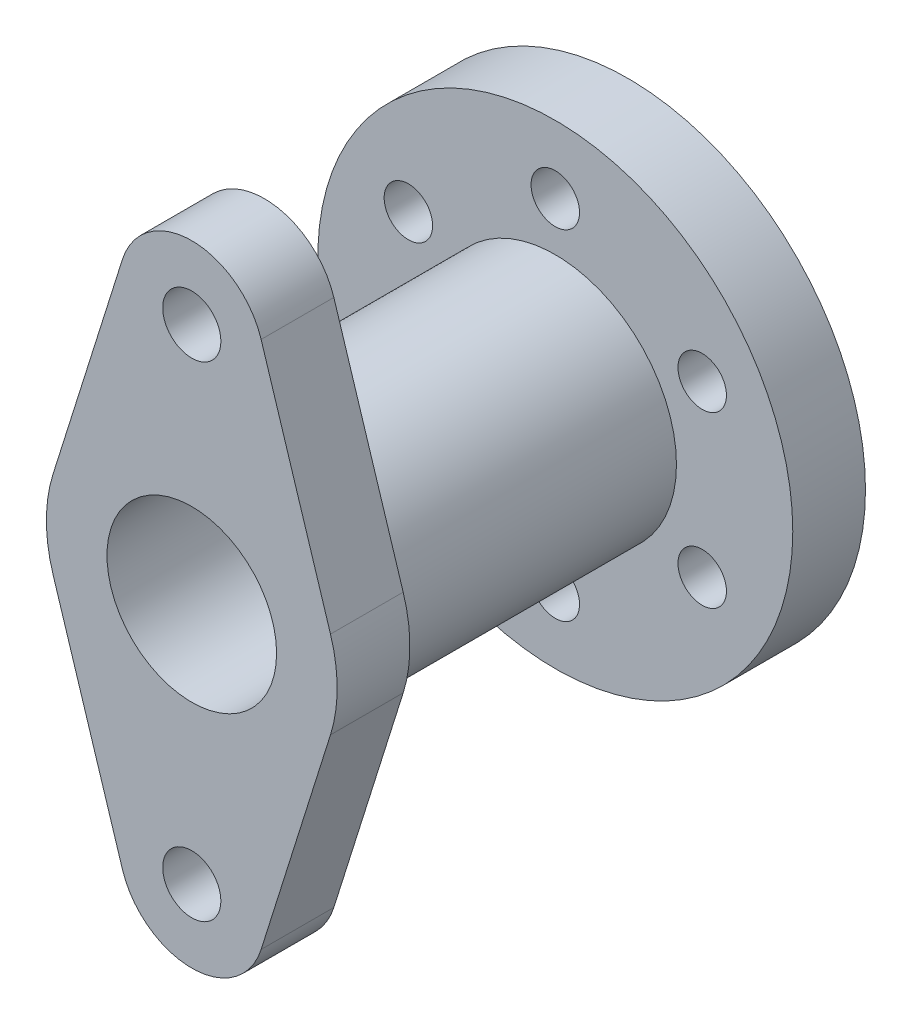
ISO-10303-21;
HEADER;
FILE_DESCRIPTION(('STEP AP214'),'2;1');
FILE_NAME('part.step','',(''),(''),'','','');
FILE_SCHEMA(('AUTOMOTIVE_DESIGN { 1 0 10303 214 1 1 1 1 }'));
ENDSEC;
DATA;
#1=APPLICATION_CONTEXT('core data for automotive mechanical design processes');
#2=APPLICATION_PROTOCOL_DEFINITION('international standard','automotive_design',2000,#1);
#3=PRODUCT_CONTEXT('',#1,'mechanical');
#4=PRODUCT('Part','Part','',(#3));
#5=PRODUCT_RELATED_PRODUCT_CATEGORY('part','',(#4));
#6=PRODUCT_DEFINITION_FORMATION('','',#4);
#7=PRODUCT_DEFINITION_CONTEXT('part definition',#1,'design');
#8=PRODUCT_DEFINITION('design','',#6,#7);
#9=PRODUCT_DEFINITION_SHAPE('','',#8);
#10=(LENGTH_UNIT() NAMED_UNIT(*) SI_UNIT(.MILLI.,.METRE.));
#11=(NAMED_UNIT(*) PLANE_ANGLE_UNIT() SI_UNIT($,.RADIAN.));
#12=(NAMED_UNIT(*) SI_UNIT($,.STERADIAN.) SOLID_ANGLE_UNIT());
#13=UNCERTAINTY_MEASURE_WITH_UNIT(LENGTH_MEASURE(1.E-05),#10,'distance_accuracy_value','');
#14=(GEOMETRIC_REPRESENTATION_CONTEXT(3) GLOBAL_UNCERTAINTY_ASSIGNED_CONTEXT((#13)) GLOBAL_UNIT_ASSIGNED_CONTEXT((#10,
#11,#12)) REPRESENTATION_CONTEXT('',''));
#15=CARTESIAN_POINT('',(0.,0.,0.));
#16=DIRECTION('',(0.,0.,1.));
#17=DIRECTION('',(1.,0.,0.));
#18=AXIS2_PLACEMENT_3D('',#15,#16,#17);
#19=CARTESIAN_POINT('',(0.,0.,190.5));
#20=DIRECTION('',(0.,0.,-1.));
#21=DIRECTION('',(-1.,0.,0.));
#22=AXIS2_PLACEMENT_3D('',#19,#20,#21);
#23=CYLINDRICAL_SURFACE('',#22,1244.6);
#24=CARTESIAN_POINT('',(0.,0.,190.5));
#25=DIRECTION('',(0.,0.,1.));
#26=DIRECTION('',(1.,0.,0.));
#27=AXIS2_PLACEMENT_3D('',#24,#25,#26);
#28=CIRCLE('',#27,1244.6);
#29=CARTESIAN_POINT('',(1244.6,0.,190.5));
#30=VERTEX_POINT('',#29);
#31=EDGE_CURVE('E11',#30,#30,#28,.T.);
#32=ORIENTED_EDGE('',*,*,#31,.F.);
#33=EDGE_LOOP('',(#32));
#34=FACE_BOUND('',#33,.T.);
#35=CARTESIAN_POINT('',(0.,0.,-190.5));
#36=DIRECTION('',(0.,0.,1.));
#37=DIRECTION('',(1.,0.,0.));
#38=AXIS2_PLACEMENT_3D('',#35,#36,#37);
#39=CIRCLE('',#38,1244.6);
#40=CARTESIAN_POINT('',(1244.6,0.,-190.5));
#41=VERTEX_POINT('',#40);
#42=EDGE_CURVE('E42',#41,#41,#39,.T.);
#43=ORIENTED_EDGE('',*,*,#42,.T.);
#44=EDGE_LOOP('',(#43));
#45=FACE_BOUND('',#44,.T.);
#46=ADVANCED_FACE('F39',(#34,#45),#23,.T.);
#47=CARTESIAN_POINT('',(0.,0.,190.5));
#48=DIRECTION('',(0.,0.,1.));
#49=DIRECTION('',(1.,0.,0.));
#50=AXIS2_PLACEMENT_3D('',#47,#48,#49);
#51=PLANE('',#50);
#52=CARTESIAN_POINT('',(0.,0.,190.5));
#53=DIRECTION('',(0.,0.,1.));
#54=DIRECTION('',(1.,0.,0.));
#55=AXIS2_PLACEMENT_3D('',#52,#53,#54);
#56=CIRCLE('',#55,635.);
#57=CARTESIAN_POINT('',(635.,0.,190.5));
#58=VERTEX_POINT('',#57);
#59=EDGE_CURVE('E167',#58,#58,#56,.T.);
#60=ORIENTED_EDGE('',*,*,#59,.F.);
#61=EDGE_LOOP('',(#60));
#62=FACE_BOUND('',#61,.T.);
#63=CARTESIAN_POINT('',(0.,889.,190.5));
#64=DIRECTION('',(0.,0.,1.));
#65=DIRECTION('',(1.,0.,0.));
#66=AXIS2_PLACEMENT_3D('',#63,#64,#65);
#67=CIRCLE('',#66,127.);
#68=CARTESIAN_POINT('',(127.,889.,190.5));
#69=VERTEX_POINT('',#68);
#70=EDGE_CURVE('E177',#69,#69,#67,.T.);
#71=ORIENTED_EDGE('',*,*,#70,.F.);
#72=EDGE_LOOP('',(#71));
#73=FACE_BOUND('',#72,.T.);
#74=CARTESIAN_POINT('',(-769.896583964361,444.500000000009,190.5));
#75=DIRECTION('',(0.,0.,1.));
#76=DIRECTION('',(1.,0.,0.));
#77=AXIS2_PLACEMENT_3D('',#74,#75,#76);
#78=CIRCLE('',#77,127.);
#79=CARTESIAN_POINT('',(-642.896583964361,444.500000000009,190.5));
#80=VERTEX_POINT('',#79);
#81=EDGE_CURVE('E181',#80,#80,#78,.T.);
#82=ORIENTED_EDGE('',*,*,#81,.F.);
#83=EDGE_LOOP('',(#82));
#84=FACE_BOUND('',#83,.T.);
#85=CARTESIAN_POINT('',(-769.896583964366,-444.5,190.5));
#86=DIRECTION('',(0.,0.,1.));
#87=DIRECTION('',(1.,0.,0.));
#88=AXIS2_PLACEMENT_3D('',#85,#86,#87);
#89=CIRCLE('',#88,127.000000000008);
#90=CARTESIAN_POINT('',(-642.896583964358,-444.5,190.5));
#91=VERTEX_POINT('',#90);
#92=EDGE_CURVE('E204',#91,#91,#89,.T.);
#93=ORIENTED_EDGE('',*,*,#92,.F.);
#94=EDGE_LOOP('',(#93));
#95=FACE_BOUND('',#94,.T.);
#96=CARTESIAN_POINT('',(0.,-889.,190.5));
#97=DIRECTION('',(0.,0.,1.));
#98=DIRECTION('',(1.,0.,0.));
#99=AXIS2_PLACEMENT_3D('',#96,#97,#98);
#100=CIRCLE('',#99,127.000000000006);
#101=CARTESIAN_POINT('',(127.000000000006,-889.,190.5));
#102=VERTEX_POINT('',#101);
#103=EDGE_CURVE('E198',#102,#102,#100,.T.);
#104=ORIENTED_EDGE('',*,*,#103,.F.);
#105=EDGE_LOOP('',(#104));
#106=FACE_BOUND('',#105,.T.);
#107=CARTESIAN_POINT('',(769.896583964374,-444.499999999987,190.5));
#108=DIRECTION('',(0.,0.,1.));
#109=DIRECTION('',(1.,0.,0.));
#110=AXIS2_PLACEMENT_3D('',#107,#108,#109);
#111=CIRCLE('',#110,127.000000000018);
#112=CARTESIAN_POINT('',(896.896583964392,-444.499999999987,190.5));
#113=VERTEX_POINT('',#112);
#114=EDGE_CURVE('E192',#113,#113,#111,.T.);
#115=ORIENTED_EDGE('',*,*,#114,.F.);
#116=EDGE_LOOP('',(#115));
#117=FACE_BOUND('',#116,.T.);
#118=CARTESIAN_POINT('',(769.896583964359,444.500000000013,190.5));
#119=DIRECTION('',(0.,0.,1.));
#120=DIRECTION('',(1.,0.,0.));
#121=AXIS2_PLACEMENT_3D('',#118,#119,#120);
#122=CIRCLE('',#121,127.000000000016);
#123=CARTESIAN_POINT('',(896.896583964375,444.500000000013,190.5));
#124=VERTEX_POINT('',#123);
#125=EDGE_CURVE('E180',#124,#124,#122,.T.);
#126=ORIENTED_EDGE('',*,*,#125,.F.);
#127=EDGE_LOOP('',(#126));
#128=FACE_BOUND('',#127,.T.);
#129=ORIENTED_EDGE('',*,*,#31,.T.);
#130=EDGE_LOOP('',(#129));
#131=FACE_BOUND('',#130,.T.);
#132=ADVANCED_FACE('F221',(#62,#73,#84,#95,#106,#117,#128,#131),#51,.T.);
#133=CARTESIAN_POINT('',(0.,0.,-190.5));
#134=DIRECTION('',(0.,0.,1.));
#135=DIRECTION('',(1.,0.,0.));
#136=AXIS2_PLACEMENT_3D('',#133,#134,#135);
#137=PLANE('',#136);
#138=CARTESIAN_POINT('',(0.,0.,-190.5));
#139=DIRECTION('',(0.,0.,1.));
#140=DIRECTION('',(1.,0.,0.));
#141=AXIS2_PLACEMENT_3D('',#138,#139,#140);
#142=CIRCLE('',#141,330.2);
#143=CARTESIAN_POINT('',(330.2,0.,-190.5));
#144=VERTEX_POINT('',#143);
#145=EDGE_CURVE('E324',#144,#144,#142,.T.);
#146=ORIENTED_EDGE('',*,*,#145,.T.);
#147=EDGE_LOOP('',(#146));
#148=FACE_BOUND('',#147,.T.);
#149=CARTESIAN_POINT('',(0.,889.,-190.5));
#150=DIRECTION('',(0.,0.,1.));
#151=DIRECTION('',(1.,0.,0.));
#152=AXIS2_PLACEMENT_3D('',#149,#150,#151);
#153=CIRCLE('',#152,127.);
#154=CARTESIAN_POINT('',(127.,889.,-190.5));
#155=VERTEX_POINT('',#154);
#156=EDGE_CURVE('E174',#155,#155,#153,.T.);
#157=ORIENTED_EDGE('',*,*,#156,.T.);
#158=EDGE_LOOP('',(#157));
#159=FACE_BOUND('',#158,.T.);
#160=CARTESIAN_POINT('',(-769.896583964361,444.500000000009,-190.5));
#161=DIRECTION('',(0.,0.,1.));
#162=DIRECTION('',(1.,0.,0.));
#163=AXIS2_PLACEMENT_3D('',#160,#161,#162);
#164=CIRCLE('',#163,127.);
#165=CARTESIAN_POINT('',(-642.896583964361,444.500000000009,-190.5));
#166=VERTEX_POINT('',#165);
#167=EDGE_CURVE('E171',#166,#166,#164,.T.);
#168=ORIENTED_EDGE('',*,*,#167,.T.);
#169=EDGE_LOOP('',(#168));
#170=FACE_BOUND('',#169,.T.);
#171=CARTESIAN_POINT('',(-769.896583964366,-444.5,-190.5));
#172=DIRECTION('',(0.,0.,1.));
#173=DIRECTION('',(1.,0.,0.));
#174=AXIS2_PLACEMENT_3D('',#171,#172,#173);
#175=CIRCLE('',#174,127.000000000008);
#176=CARTESIAN_POINT('',(-642.896583964358,-444.5,-190.5));
#177=VERTEX_POINT('',#176);
#178=EDGE_CURVE('E184',#177,#177,#175,.T.);
#179=ORIENTED_EDGE('',*,*,#178,.T.);
#180=EDGE_LOOP('',(#179));
#181=FACE_BOUND('',#180,.T.);
#182=CARTESIAN_POINT('',(0.,-889.,-190.5));
#183=DIRECTION('',(0.,0.,1.));
#184=DIRECTION('',(1.,0.,0.));
#185=AXIS2_PLACEMENT_3D('',#182,#183,#184);
#186=CIRCLE('',#185,127.000000000006);
#187=CARTESIAN_POINT('',(127.000000000006,-889.,-190.5));
#188=VERTEX_POINT('',#187);
#189=EDGE_CURVE('E201',#188,#188,#186,.T.);
#190=ORIENTED_EDGE('',*,*,#189,.T.);
#191=EDGE_LOOP('',(#190));
#192=FACE_BOUND('',#191,.T.);
#193=CARTESIAN_POINT('',(769.896583964374,-444.499999999987,-190.5));
#194=DIRECTION('',(0.,0.,1.));
#195=DIRECTION('',(1.,0.,0.));
#196=AXIS2_PLACEMENT_3D('',#193,#194,#195);
#197=CIRCLE('',#196,127.000000000018);
#198=CARTESIAN_POINT('',(896.896583964392,-444.499999999987,-190.5));
#199=VERTEX_POINT('',#198);
#200=EDGE_CURVE('E195',#199,#199,#197,.T.);
#201=ORIENTED_EDGE('',*,*,#200,.T.);
#202=EDGE_LOOP('',(#201));
#203=FACE_BOUND('',#202,.T.);
#204=CARTESIAN_POINT('',(769.896583964359,444.500000000013,-190.5));
#205=DIRECTION('',(0.,0.,1.));
#206=DIRECTION('',(1.,0.,0.));
#207=AXIS2_PLACEMENT_3D('',#204,#205,#206);
#208=CIRCLE('',#207,127.000000000016);
#209=CARTESIAN_POINT('',(896.896583964375,444.500000000013,-190.5));
#210=VERTEX_POINT('',#209);
#211=EDGE_CURVE('E189',#210,#210,#208,.T.);
#212=ORIENTED_EDGE('',*,*,#211,.T.);
#213=EDGE_LOOP('',(#212));
#214=FACE_BOUND('',#213,.T.);
#215=ORIENTED_EDGE('',*,*,#42,.F.);
#216=EDGE_LOOP('',(#215));
#217=FACE_BOUND('',#216,.T.);
#218=ADVANCED_FACE('F210',(#148,#159,#170,#181,#192,#203,#214,#217),#137,.F.);
#219=CARTESIAN_POINT('',(769.896583964359,444.500000000013,-190.5));
#220=DIRECTION('',(0.,0.,1.));
#221=DIRECTION('',(1.,0.,0.));
#222=AXIS2_PLACEMENT_3D('',#219,#220,#221);
#223=CYLINDRICAL_SURFACE('',#222,127.000000000016);
#224=ORIENTED_EDGE('',*,*,#211,.F.);
#225=EDGE_LOOP('',(#224));
#226=FACE_BOUND('',#225,.T.);
#227=ORIENTED_EDGE('',*,*,#125,.T.);
#228=EDGE_LOOP('',(#227));
#229=FACE_BOUND('',#228,.T.);
#230=ADVANCED_FACE('F240',(#226,#229),#223,.F.);
#231=CARTESIAN_POINT('',(769.896583964374,-444.499999999987,-190.5));
#232=DIRECTION('',(0.,0.,1.));
#233=DIRECTION('',(1.,0.,0.));
#234=AXIS2_PLACEMENT_3D('',#231,#232,#233);
#235=CYLINDRICAL_SURFACE('',#234,127.000000000018);
#236=ORIENTED_EDGE('',*,*,#200,.F.);
#237=EDGE_LOOP('',(#236));
#238=FACE_BOUND('',#237,.T.);
#239=ORIENTED_EDGE('',*,*,#114,.T.);
#240=EDGE_LOOP('',(#239));
#241=FACE_BOUND('',#240,.T.);
#242=ADVANCED_FACE('F245',(#238,#241),#235,.F.);
#243=CARTESIAN_POINT('',(0.,-889.,-190.5));
#244=DIRECTION('',(0.,0.,1.));
#245=DIRECTION('',(1.,0.,0.));
#246=AXIS2_PLACEMENT_3D('',#243,#244,#245);
#247=CYLINDRICAL_SURFACE('',#246,127.000000000006);
#248=ORIENTED_EDGE('',*,*,#189,.F.);
#249=EDGE_LOOP('',(#248));
#250=FACE_BOUND('',#249,.T.);
#251=ORIENTED_EDGE('',*,*,#103,.T.);
#252=EDGE_LOOP('',(#251));
#253=FACE_BOUND('',#252,.T.);
#254=ADVANCED_FACE('F217',(#250,#253),#247,.F.);
#255=CARTESIAN_POINT('',(-769.896583964366,-444.5,-190.5));
#256=DIRECTION('',(0.,0.,1.));
#257=DIRECTION('',(1.,0.,0.));
#258=AXIS2_PLACEMENT_3D('',#255,#256,#257);
#259=CYLINDRICAL_SURFACE('',#258,127.000000000008);
#260=ORIENTED_EDGE('',*,*,#178,.F.);
#261=EDGE_LOOP('',(#260));
#262=FACE_BOUND('',#261,.T.);
#263=ORIENTED_EDGE('',*,*,#92,.T.);
#264=EDGE_LOOP('',(#263));
#265=FACE_BOUND('',#264,.T.);
#266=ADVANCED_FACE('F213',(#262,#265),#259,.F.);
#267=CARTESIAN_POINT('',(-769.896583964361,444.500000000009,-190.5));
#268=DIRECTION('',(0.,0.,1.));
#269=DIRECTION('',(1.,0.,0.));
#270=AXIS2_PLACEMENT_3D('',#267,#268,#269);
#271=CYLINDRICAL_SURFACE('',#270,127.);
#272=ORIENTED_EDGE('',*,*,#167,.F.);
#273=EDGE_LOOP('',(#272));
#274=FACE_BOUND('',#273,.T.);
#275=ORIENTED_EDGE('',*,*,#81,.T.);
#276=EDGE_LOOP('',(#275));
#277=FACE_BOUND('',#276,.T.);
#278=ADVANCED_FACE('F216',(#274,#277),#271,.F.);
#279=CARTESIAN_POINT('',(0.,889.,-190.5));
#280=DIRECTION('',(0.,0.,1.));
#281=DIRECTION('',(1.,0.,0.));
#282=AXIS2_PLACEMENT_3D('',#279,#280,#281);
#283=CYLINDRICAL_SURFACE('',#282,127.);
#284=ORIENTED_EDGE('',*,*,#156,.F.);
#285=EDGE_LOOP('',(#284));
#286=FACE_BOUND('',#285,.T.);
#287=ORIENTED_EDGE('',*,*,#70,.T.);
#288=EDGE_LOOP('',(#287));
#289=FACE_BOUND('',#288,.T.);
#290=ADVANCED_FACE('F259',(#286,#289),#283,.F.);
#291=CARTESIAN_POINT('',(0.,0.,1714.5));
#292=DIRECTION('',(0.,0.,-1.));
#293=DIRECTION('',(-1.,0.,0.));
#294=AXIS2_PLACEMENT_3D('',#291,#292,#293);
#295=CYLINDRICAL_SURFACE('',#294,635.);
#296=CARTESIAN_POINT('',(0.,0.,1714.5));
#297=DIRECTION('',(0.,0.,1.));
#298=DIRECTION('',(1.,0.,0.));
#299=AXIS2_PLACEMENT_3D('',#296,#297,#298);
#300=CIRCLE('',#299,635.);
#301=CARTESIAN_POINT('',(635.,0.,1714.5));
#302=VERTEX_POINT('',#301);
#303=EDGE_CURVE('E168',#302,#302,#300,.T.);
#304=ORIENTED_EDGE('',*,*,#303,.F.);
#305=EDGE_LOOP('',(#304));
#306=FACE_BOUND('',#305,.T.);
#307=ORIENTED_EDGE('',*,*,#59,.T.);
#308=EDGE_LOOP('',(#307));
#309=FACE_BOUND('',#308,.T.);
#310=ADVANCED_FACE('F263',(#306,#309),#295,.T.);
#311=CARTESIAN_POINT('',(0.,-1270.,2095.5));
#312=DIRECTION('',(0.,0.,-1.));
#313=DIRECTION('',(-1.,0.,0.));
#314=AXIS2_PLACEMENT_3D('',#311,#312,#313);
#315=PLANE('',#314);
#316=CARTESIAN_POINT('',(0.,0.,2095.5));
#317=DIRECTION('',(0.,0.,1.));
#318=DIRECTION('',(1.,0.,0.));
#319=AXIS2_PLACEMENT_3D('',#316,#317,#318);
#320=CIRCLE('',#319,444.5);
#321=CARTESIAN_POINT('',(444.5,0.,2095.5));
#322=VERTEX_POINT('',#321);
#323=EDGE_CURVE('E329',#322,#322,#320,.T.);
#324=ORIENTED_EDGE('',*,*,#323,.F.);
#325=EDGE_LOOP('',(#324));
#326=FACE_BOUND('',#325,.T.);
#327=CARTESIAN_POINT('',(0.,-1270.,2095.5));
#328=DIRECTION('',(0.,0.,1.));
#329=DIRECTION('',(-1.,0.,0.));
#330=AXIS2_PLACEMENT_3D('',#327,#328,#329);
#331=CIRCLE('',#330,381.);
#332=CARTESIAN_POINT('',(-363.450835739856,-1384.3,2095.5));
#333=VERTEX_POINT('',#332);
#334=CARTESIAN_POINT('',(363.450835739856,-1384.3,2095.5));
#335=VERTEX_POINT('',#334);
#336=EDGE_CURVE('E152',#333,#335,#331,.T.);
#337=ORIENTED_EDGE('',*,*,#336,.T.);
#338=DIRECTION('',(0.3,0.953939201416946,0.));
#339=VECTOR('',#338,1.);
#340=CARTESIAN_POINT('',(363.450835739856,-1384.3,2095.5));
#341=LINE('',#340,#339);
#342=CARTESIAN_POINT('',(726.901671479712,-228.600000000003,2095.5));
#343=VERTEX_POINT('',#342);
#344=EDGE_CURVE('E99',#335,#343,#341,.T.);
#345=ORIENTED_EDGE('',*,*,#344,.T.);
#346=CARTESIAN_POINT('',(0.,0.,2095.5));
#347=DIRECTION('',(0.,0.,1.));
#348=DIRECTION('',(-1.,0.,0.));
#349=AXIS2_PLACEMENT_3D('',#346,#347,#348);
#350=CIRCLE('',#349,762.);
#351=CARTESIAN_POINT('',(726.901671479712,228.600000000003,2095.5));
#352=VERTEX_POINT('',#351);
#353=EDGE_CURVE('E350',#343,#352,#350,.T.);
#354=ORIENTED_EDGE('',*,*,#353,.T.);
#355=DIRECTION('',(-0.3,0.953939201416946,0.));
#356=VECTOR('',#355,1.);
#357=CARTESIAN_POINT('',(726.901671479712,228.600000000003,2095.5));
#358=LINE('',#357,#356);
#359=CARTESIAN_POINT('',(363.450835739856,1384.3,2095.5));
#360=VERTEX_POINT('',#359);
#361=EDGE_CURVE('E352',#352,#360,#358,.T.);
#362=ORIENTED_EDGE('',*,*,#361,.T.);
#363=CARTESIAN_POINT('',(0.,1270.,2095.5));
#364=DIRECTION('',(0.,0.,1.));
#365=DIRECTION('',(1.,0.,0.));
#366=AXIS2_PLACEMENT_3D('',#363,#364,#365);
#367=CIRCLE('',#366,381.);
#368=CARTESIAN_POINT('',(-363.450835739856,1384.3,2095.5));
#369=VERTEX_POINT('',#368);
#370=EDGE_CURVE('E119',#360,#369,#367,.T.);
#371=ORIENTED_EDGE('',*,*,#370,.T.);
#372=DIRECTION('',(-0.3,-0.953939201416946,0.));
#373=VECTOR('',#372,1.);
#374=CARTESIAN_POINT('',(-363.450835739856,1384.3,2095.5));
#375=LINE('',#374,#373);
#376=CARTESIAN_POINT('',(-726.901671479712,228.6,2095.5));
#377=VERTEX_POINT('',#376);
#378=EDGE_CURVE('E112',#369,#377,#375,.T.);
#379=ORIENTED_EDGE('',*,*,#378,.T.);
#380=CARTESIAN_POINT('',(0.,0.,2095.5));
#381=DIRECTION('',(0.,0.,1.));
#382=DIRECTION('',(-1.,0.,0.));
#383=AXIS2_PLACEMENT_3D('',#380,#381,#382);
#384=CIRCLE('',#383,762.);
#385=CARTESIAN_POINT('',(-726.901671479712,-228.6,2095.5));
#386=VERTEX_POINT('',#385);
#387=EDGE_CURVE('E117',#377,#386,#384,.T.);
#388=ORIENTED_EDGE('',*,*,#387,.T.);
#389=DIRECTION('',(0.3,-0.953939201416946,0.));
#390=VECTOR('',#389,1.);
#391=CARTESIAN_POINT('',(-726.901671479712,-228.6,2095.5));
#392=LINE('',#391,#390);
#393=EDGE_CURVE('E55',#386,#333,#392,.T.);
#394=ORIENTED_EDGE('',*,*,#393,.T.);
#395=EDGE_LOOP('',(#337,#345,#354,#362,#371,#379,#388,#394));
#396=FACE_BOUND('',#395,.T.);
#397=CARTESIAN_POINT('',(0.,-1270.,2095.5));
#398=DIRECTION('',(0.,0.,1.));
#399=DIRECTION('',(1.,0.,0.));
#400=AXIS2_PLACEMENT_3D('',#397,#398,#399);
#401=CIRCLE('',#400,152.4);
#402=CARTESIAN_POINT('',(152.4,-1270.,2095.5));
#403=VERTEX_POINT('',#402);
#404=EDGE_CURVE('E141',#403,#403,#401,.T.);
#405=ORIENTED_EDGE('',*,*,#404,.F.);
#406=EDGE_LOOP('',(#405));
#407=FACE_BOUND('',#406,.T.);
#408=CARTESIAN_POINT('',(0.,1270.,2095.5));
#409=DIRECTION('',(0.,0.,1.));
#410=DIRECTION('',(1.,0.,0.));
#411=AXIS2_PLACEMENT_3D('',#408,#409,#410);
#412=CIRCLE('',#411,152.4);
#413=CARTESIAN_POINT('',(152.4,1270.,2095.5));
#414=VERTEX_POINT('',#413);
#415=EDGE_CURVE('E338',#414,#414,#412,.T.);
#416=ORIENTED_EDGE('',*,*,#415,.F.);
#417=EDGE_LOOP('',(#416));
#418=FACE_BOUND('',#417,.T.);
#419=ADVANCED_FACE('F114',(#326,#396,#407,#418),#315,.F.);
#420=CARTESIAN_POINT('',(0.,-1270.,1714.5));
#421=DIRECTION('',(0.,0.,-1.));
#422=DIRECTION('',(-1.,0.,0.));
#423=AXIS2_PLACEMENT_3D('',#420,#421,#422);
#424=PLANE('',#423);
#425=ORIENTED_EDGE('',*,*,#303,.T.);
#426=EDGE_LOOP('',(#425));
#427=FACE_BOUND('',#426,.T.);
#428=CARTESIAN_POINT('',(0.,-1270.,1714.5));
#429=DIRECTION('',(0.,0.,1.));
#430=DIRECTION('',(1.,0.,0.));
#431=AXIS2_PLACEMENT_3D('',#428,#429,#430);
#432=CIRCLE('',#431,152.4);
#433=CARTESIAN_POINT('',(152.4,-1270.,1714.5));
#434=VERTEX_POINT('',#433);
#435=EDGE_CURVE('E341',#434,#434,#432,.T.);
#436=ORIENTED_EDGE('',*,*,#435,.T.);
#437=EDGE_LOOP('',(#436));
#438=FACE_BOUND('',#437,.T.);
#439=CARTESIAN_POINT('',(0.,-1270.,1714.5));
#440=DIRECTION('',(0.,0.,1.));
#441=DIRECTION('',(-1.,0.,0.));
#442=AXIS2_PLACEMENT_3D('',#439,#440,#441);
#443=CIRCLE('',#442,381.);
#444=CARTESIAN_POINT('',(-363.450835739856,-1384.3,1714.5));
#445=VERTEX_POINT('',#444);
#446=CARTESIAN_POINT('',(363.450835739856,-1384.3,1714.5));
#447=VERTEX_POINT('',#446);
#448=EDGE_CURVE('E137',#445,#447,#443,.T.);
#449=ORIENTED_EDGE('',*,*,#448,.F.);
#450=DIRECTION('',(0.3,-0.953939201416946,0.));
#451=VECTOR('',#450,1.);
#452=CARTESIAN_POINT('',(-726.901671479712,-228.6,1714.5));
#453=LINE('',#452,#451);
#454=CARTESIAN_POINT('',(-726.901671479712,-228.6,1714.5));
#455=VERTEX_POINT('',#454);
#456=EDGE_CURVE('E90',#455,#445,#453,.T.);
#457=ORIENTED_EDGE('',*,*,#456,.F.);
#458=CARTESIAN_POINT('',(0.,0.,1714.5));
#459=DIRECTION('',(0.,0.,1.));
#460=DIRECTION('',(-1.,0.,0.));
#461=AXIS2_PLACEMENT_3D('',#458,#459,#460);
#462=CIRCLE('',#461,762.);
#463=CARTESIAN_POINT('',(-726.901671479712,228.6,1714.5));
#464=VERTEX_POINT('',#463);
#465=EDGE_CURVE('E84',#464,#455,#462,.T.);
#466=ORIENTED_EDGE('',*,*,#465,.F.);
#467=DIRECTION('',(-0.3,-0.953939201416946,0.));
#468=VECTOR('',#467,1.);
#469=CARTESIAN_POINT('',(-363.450835739856,1384.3,1714.5));
#470=LINE('',#469,#468);
#471=CARTESIAN_POINT('',(-363.450835739856,1384.3,1714.5));
#472=VERTEX_POINT('',#471);
#473=EDGE_CURVE('E127',#472,#464,#470,.T.);
#474=ORIENTED_EDGE('',*,*,#473,.F.);
#475=CARTESIAN_POINT('',(0.,1270.,1714.5));
#476=DIRECTION('',(0.,0.,1.));
#477=DIRECTION('',(1.,0.,0.));
#478=AXIS2_PLACEMENT_3D('',#475,#476,#477);
#479=CIRCLE('',#478,381.);
#480=CARTESIAN_POINT('',(363.450835739856,1384.3,1714.5));
#481=VERTEX_POINT('',#480);
#482=EDGE_CURVE('E147',#481,#472,#479,.T.);
#483=ORIENTED_EDGE('',*,*,#482,.F.);
#484=DIRECTION('',(-0.3,0.953939201416946,0.));
#485=VECTOR('',#484,1.);
#486=CARTESIAN_POINT('',(726.901671479712,228.600000000003,1714.5));
#487=LINE('',#486,#485);
#488=CARTESIAN_POINT('',(726.901671479712,228.600000000003,1714.5));
#489=VERTEX_POINT('',#488);
#490=EDGE_CURVE('E145',#489,#481,#487,.T.);
#491=ORIENTED_EDGE('',*,*,#490,.F.);
#492=CARTESIAN_POINT('',(0.,0.,1714.5));
#493=DIRECTION('',(0.,0.,1.));
#494=DIRECTION('',(-1.,0.,0.));
#495=AXIS2_PLACEMENT_3D('',#492,#493,#494);
#496=CIRCLE('',#495,762.);
#497=CARTESIAN_POINT('',(726.901671479712,-228.600000000003,1714.5));
#498=VERTEX_POINT('',#497);
#499=EDGE_CURVE('E143',#498,#489,#496,.T.);
#500=ORIENTED_EDGE('',*,*,#499,.F.);
#501=DIRECTION('',(0.3,0.953939201416946,0.));
#502=VECTOR('',#501,1.);
#503=CARTESIAN_POINT('',(363.450835739856,-1384.3,1714.5));
#504=LINE('',#503,#502);
#505=EDGE_CURVE('E140',#447,#498,#504,.T.);
#506=ORIENTED_EDGE('',*,*,#505,.F.);
#507=EDGE_LOOP('',(#449,#457,#466,#474,#483,#491,#500,#506));
#508=FACE_BOUND('',#507,.T.);
#509=CARTESIAN_POINT('',(0.,1270.,1714.5));
#510=DIRECTION('',(0.,0.,1.));
#511=DIRECTION('',(1.,0.,0.));
#512=AXIS2_PLACEMENT_3D('',#509,#510,#511);
#513=CIRCLE('',#512,152.4);
#514=CARTESIAN_POINT('',(152.4,1270.,1714.5));
#515=VERTEX_POINT('',#514);
#516=EDGE_CURVE('E335',#515,#515,#513,.T.);
#517=ORIENTED_EDGE('',*,*,#516,.T.);
#518=EDGE_LOOP('',(#517));
#519=FACE_BOUND('',#518,.T.);
#520=ADVANCED_FACE('F272',(#427,#438,#508,#519),#424,.T.);
#521=CARTESIAN_POINT('',(0.,-1270.,2095.5));
#522=DIRECTION('',(0.,0.,-1.));
#523=DIRECTION('',(-1.,0.,0.));
#524=AXIS2_PLACEMENT_3D('',#521,#522,#523);
#525=CYLINDRICAL_SURFACE('',#524,381.);
#526=ORIENTED_EDGE('',*,*,#448,.T.);
#527=DIRECTION('',(0.,0.,-1.));
#528=VECTOR('',#527,1.);
#529=CARTESIAN_POINT('',(363.450835739856,-1384.3,2095.5));
#530=LINE('',#529,#528);
#531=EDGE_CURVE('E165',#335,#447,#530,.T.);
#532=ORIENTED_EDGE('',*,*,#531,.F.);
#533=ORIENTED_EDGE('',*,*,#336,.F.);
#534=DIRECTION('',(0.,0.,-1.));
#535=VECTOR('',#534,1.);
#536=CARTESIAN_POINT('',(-363.450835739856,-1384.3,2095.5));
#537=LINE('',#536,#535);
#538=EDGE_CURVE('E133',#333,#445,#537,.T.);
#539=ORIENTED_EDGE('',*,*,#538,.T.);
#540=EDGE_LOOP('',(#526,#532,#533,#539));
#541=FACE_BOUND('',#540,.T.);
#542=ADVANCED_FACE('F268',(#541),#525,.T.);
#543=CARTESIAN_POINT('',(363.450835739856,-1384.3,2095.5));
#544=DIRECTION('',(-0.953939201416946,0.3,0.));
#545=DIRECTION('',(-0.3,-0.953939201416946,0.));
#546=AXIS2_PLACEMENT_3D('',#543,#544,#545);
#547=PLANE('',#546);
#548=ORIENTED_EDGE('',*,*,#505,.T.);
#549=DIRECTION('',(0.,0.,-1.));
#550=VECTOR('',#549,1.);
#551=CARTESIAN_POINT('',(726.901671479712,-228.600000000003,2095.5));
#552=LINE('',#551,#550);
#553=EDGE_CURVE('E162',#343,#498,#552,.T.);
#554=ORIENTED_EDGE('',*,*,#553,.F.);
#555=ORIENTED_EDGE('',*,*,#344,.F.);
#556=ORIENTED_EDGE('',*,*,#531,.T.);
#557=EDGE_LOOP('',(#548,#554,#555,#556));
#558=FACE_BOUND('',#557,.T.);
#559=ADVANCED_FACE('F271',(#558),#547,.F.);
#560=CARTESIAN_POINT('',(0.,0.,2095.5));
#561=DIRECTION('',(0.,0.,-1.));
#562=DIRECTION('',(-1.,0.,0.));
#563=AXIS2_PLACEMENT_3D('',#560,#561,#562);
#564=CYLINDRICAL_SURFACE('',#563,762.);
#565=ORIENTED_EDGE('',*,*,#499,.T.);
#566=DIRECTION('',(0.,0.,-1.));
#567=VECTOR('',#566,1.);
#568=CARTESIAN_POINT('',(726.901671479712,228.600000000003,2095.5));
#569=LINE('',#568,#567);
#570=EDGE_CURVE('E159',#352,#489,#569,.T.);
#571=ORIENTED_EDGE('',*,*,#570,.F.);
#572=ORIENTED_EDGE('',*,*,#353,.F.);
#573=ORIENTED_EDGE('',*,*,#553,.T.);
#574=EDGE_LOOP('',(#565,#571,#572,#573));
#575=FACE_BOUND('',#574,.T.);
#576=ADVANCED_FACE('F276',(#575),#564,.T.);
#577=CARTESIAN_POINT('',(726.901671479712,228.600000000003,2095.5));
#578=DIRECTION('',(-0.953939201416946,-0.3,0.));
#579=DIRECTION('',(0.3,-0.953939201416946,0.));
#580=AXIS2_PLACEMENT_3D('',#577,#578,#579);
#581=PLANE('',#580);
#582=ORIENTED_EDGE('',*,*,#490,.T.);
#583=DIRECTION('',(0.,0.,-1.));
#584=VECTOR('',#583,1.);
#585=CARTESIAN_POINT('',(363.450835739856,1384.3,2095.5));
#586=LINE('',#585,#584);
#587=EDGE_CURVE('E156',#360,#481,#586,.T.);
#588=ORIENTED_EDGE('',*,*,#587,.F.);
#589=ORIENTED_EDGE('',*,*,#361,.F.);
#590=ORIENTED_EDGE('',*,*,#570,.T.);
#591=EDGE_LOOP('',(#582,#588,#589,#590));
#592=FACE_BOUND('',#591,.T.);
#593=ADVANCED_FACE('F279',(#592),#581,.F.);
#594=CARTESIAN_POINT('',(0.,1270.,2095.5));
#595=DIRECTION('',(0.,0.,-1.));
#596=DIRECTION('',(-1.,0.,0.));
#597=AXIS2_PLACEMENT_3D('',#594,#595,#596);
#598=CYLINDRICAL_SURFACE('',#597,381.);
#599=ORIENTED_EDGE('',*,*,#482,.T.);
#600=DIRECTION('',(0.,0.,-1.));
#601=VECTOR('',#600,1.);
#602=CARTESIAN_POINT('',(-363.450835739856,1384.3,2095.5));
#603=LINE('',#602,#601);
#604=EDGE_CURVE('E128',#369,#472,#603,.T.);
#605=ORIENTED_EDGE('',*,*,#604,.F.);
#606=ORIENTED_EDGE('',*,*,#370,.F.);
#607=ORIENTED_EDGE('',*,*,#587,.T.);
#608=EDGE_LOOP('',(#599,#605,#606,#607));
#609=FACE_BOUND('',#608,.T.);
#610=ADVANCED_FACE('F283',(#609),#598,.T.);
#611=CARTESIAN_POINT('',(-363.450835739856,1384.3,2095.5));
#612=DIRECTION('',(0.953939201416946,-0.3,0.));
#613=DIRECTION('',(0.3,0.953939201416946,0.));
#614=AXIS2_PLACEMENT_3D('',#611,#612,#613);
#615=PLANE('',#614);
#616=ORIENTED_EDGE('',*,*,#473,.T.);
#617=DIRECTION('',(0.,0.,-1.));
#618=VECTOR('',#617,1.);
#619=CARTESIAN_POINT('',(-726.901671479712,228.6,2095.5));
#620=LINE('',#619,#618);
#621=EDGE_CURVE('E124',#377,#464,#620,.T.);
#622=ORIENTED_EDGE('',*,*,#621,.F.);
#623=ORIENTED_EDGE('',*,*,#378,.F.);
#624=ORIENTED_EDGE('',*,*,#604,.T.);
#625=EDGE_LOOP('',(#616,#622,#623,#624));
#626=FACE_BOUND('',#625,.T.);
#627=ADVANCED_FACE('F125',(#626),#615,.F.);
#628=CARTESIAN_POINT('',(0.,0.,2095.5));
#629=DIRECTION('',(0.,0.,-1.));
#630=DIRECTION('',(-1.,0.,0.));
#631=AXIS2_PLACEMENT_3D('',#628,#629,#630);
#632=CYLINDRICAL_SURFACE('',#631,762.);
#633=ORIENTED_EDGE('',*,*,#465,.T.);
#634=DIRECTION('',(0.,0.,-1.));
#635=VECTOR('',#634,1.);
#636=CARTESIAN_POINT('',(-726.901671479712,-228.6,2095.5));
#637=LINE('',#636,#635);
#638=EDGE_CURVE('E129',#386,#455,#637,.T.);
#639=ORIENTED_EDGE('',*,*,#638,.F.);
#640=ORIENTED_EDGE('',*,*,#387,.F.);
#641=ORIENTED_EDGE('',*,*,#621,.T.);
#642=EDGE_LOOP('',(#633,#639,#640,#641));
#643=FACE_BOUND('',#642,.T.);
#644=ADVANCED_FACE('F131',(#643),#632,.T.);
#645=CARTESIAN_POINT('',(-726.901671479712,-228.6,2095.5));
#646=DIRECTION('',(0.953939201416946,0.3,0.));
#647=DIRECTION('',(-0.3,0.953939201416946,0.));
#648=AXIS2_PLACEMENT_3D('',#645,#646,#647);
#649=PLANE('',#648);
#650=ORIENTED_EDGE('',*,*,#456,.T.);
#651=ORIENTED_EDGE('',*,*,#538,.F.);
#652=ORIENTED_EDGE('',*,*,#393,.F.);
#653=ORIENTED_EDGE('',*,*,#638,.T.);
#654=EDGE_LOOP('',(#650,#651,#652,#653));
#655=FACE_BOUND('',#654,.T.);
#656=ADVANCED_FACE('F292',(#655),#649,.F.);
#657=CARTESIAN_POINT('',(0.,-1270.,2095.5));
#658=DIRECTION('',(0.,0.,-1.));
#659=DIRECTION('',(-1.,0.,0.));
#660=AXIS2_PLACEMENT_3D('',#657,#658,#659);
#661=CYLINDRICAL_SURFACE('',#660,152.4);
#662=ORIENTED_EDGE('',*,*,#404,.T.);
#663=EDGE_LOOP('',(#662));
#664=FACE_BOUND('',#663,.T.);
#665=ORIENTED_EDGE('',*,*,#435,.F.);
#666=EDGE_LOOP('',(#665));
#667=FACE_BOUND('',#666,.T.);
#668=ADVANCED_FACE('F295',(#664,#667),#661,.F.);
#669=CARTESIAN_POINT('',(0.,1270.,2095.5));
#670=DIRECTION('',(0.,0.,-1.));
#671=DIRECTION('',(-1.,0.,0.));
#672=AXIS2_PLACEMENT_3D('',#669,#670,#671);
#673=CYLINDRICAL_SURFACE('',#672,152.4);
#674=ORIENTED_EDGE('',*,*,#415,.T.);
#675=EDGE_LOOP('',(#674));
#676=FACE_BOUND('',#675,.T.);
#677=ORIENTED_EDGE('',*,*,#516,.F.);
#678=EDGE_LOOP('',(#677));
#679=FACE_BOUND('',#678,.T.);
#680=ADVANCED_FACE('F304',(#676,#679),#673,.F.);
#681=CARTESIAN_POINT('',(0.,0.,1333.5));
#682=DIRECTION('',(0.,0.,1.));
#683=DIRECTION('',(1.,0.,0.));
#684=AXIS2_PLACEMENT_3D('',#681,#682,#683);
#685=CYLINDRICAL_SURFACE('',#684,444.5);
#686=CARTESIAN_POINT('',(0.,0.,1333.5));
#687=DIRECTION('',(0.,0.,1.));
#688=DIRECTION('',(1.,0.,0.));
#689=AXIS2_PLACEMENT_3D('',#686,#687,#688);
#690=CIRCLE('',#689,444.5);
#691=CARTESIAN_POINT('',(444.5,0.,1333.5));
#692=VERTEX_POINT('',#691);
#693=EDGE_CURVE('E332',#692,#692,#690,.T.);
#694=ORIENTED_EDGE('',*,*,#693,.F.);
#695=EDGE_LOOP('',(#694));
#696=FACE_BOUND('',#695,.T.);
#697=ORIENTED_EDGE('',*,*,#323,.T.);
#698=EDGE_LOOP('',(#697));
#699=FACE_BOUND('',#698,.T.);
#700=ADVANCED_FACE('F308',(#696,#699),#685,.F.);
#701=CARTESIAN_POINT('',(0.,0.,1333.5));
#702=DIRECTION('',(0.,0.,1.));
#703=DIRECTION('',(1.,0.,0.));
#704=AXIS2_PLACEMENT_3D('',#701,#702,#703);
#705=PLANE('',#704);
#706=CARTESIAN_POINT('',(0.,0.,1333.5));
#707=DIRECTION('',(0.,0.,1.));
#708=DIRECTION('',(1.,0.,0.));
#709=AXIS2_PLACEMENT_3D('',#706,#707,#708);
#710=CIRCLE('',#709,330.2);
#711=CARTESIAN_POINT('',(330.2,0.,1333.5));
#712=VERTEX_POINT('',#711);
#713=EDGE_CURVE('E327',#712,#712,#710,.T.);
#714=ORIENTED_EDGE('',*,*,#713,.F.);
#715=EDGE_LOOP('',(#714));
#716=FACE_BOUND('',#715,.T.);
#717=ORIENTED_EDGE('',*,*,#693,.T.);
#718=EDGE_LOOP('',(#717));
#719=FACE_BOUND('',#718,.T.);
#720=ADVANCED_FACE('F312',(#716,#719),#705,.T.);
#721=CARTESIAN_POINT('',(0.,0.,-190.5));
#722=DIRECTION('',(0.,0.,1.));
#723=DIRECTION('',(1.,0.,0.));
#724=AXIS2_PLACEMENT_3D('',#721,#722,#723);
#725=CYLINDRICAL_SURFACE('',#724,330.2);
#726=ORIENTED_EDGE('',*,*,#145,.F.);
#727=EDGE_LOOP('',(#726));
#728=FACE_BOUND('',#727,.T.);
#729=ORIENTED_EDGE('',*,*,#713,.T.);
#730=EDGE_LOOP('',(#729));
#731=FACE_BOUND('',#730,.T.);
#732=ADVANCED_FACE('F316',(#728,#731),#725,.F.);
#733=CLOSED_SHELL('',(#46,#132,#218,#230,#242,#254,#266,#278,#290,#310,#419,#520,#542,#559,#576,
#593,#610,#627,#644,#656,#668,#680,#700,#720,#732));
#734=MANIFOLD_SOLID_BREP('B2',#733);
#735=ADVANCED_BREP_SHAPE_REPRESENTATION('',(#18,#734),#14);
#736=SHAPE_DEFINITION_REPRESENTATION(#9,#735);
ENDSEC;
END-ISO-10303-21;
